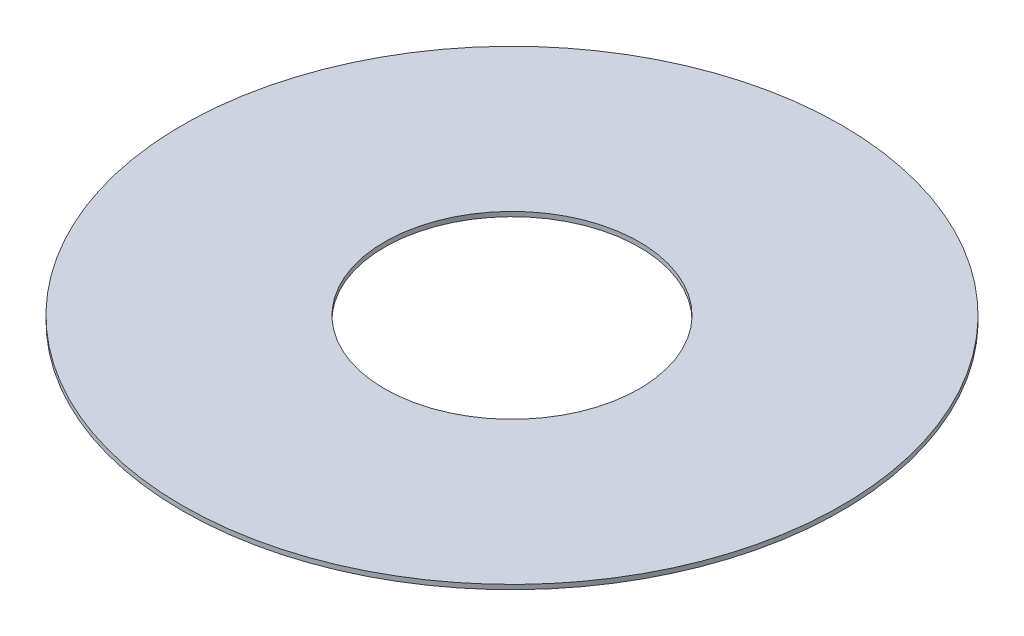
ISO-10303-21;
HEADER;
FILE_DESCRIPTION(('STEP AP214'),'2;1');
FILE_NAME('part.step','',(''),(''),'','','');
FILE_SCHEMA(('AUTOMOTIVE_DESIGN { 1 0 10303 214 1 1 1 1 }'));
ENDSEC;
DATA;
#1=APPLICATION_CONTEXT('core data for automotive mechanical design processes');
#2=APPLICATION_PROTOCOL_DEFINITION('international standard','automotive_design',2000,#1);
#3=PRODUCT_CONTEXT('',#1,'mechanical');
#4=PRODUCT('Part','Part','',(#3));
#5=PRODUCT_RELATED_PRODUCT_CATEGORY('part','',(#4));
#6=PRODUCT_DEFINITION_FORMATION('','',#4);
#7=PRODUCT_DEFINITION_CONTEXT('part definition',#1,'design');
#8=PRODUCT_DEFINITION('design','',#6,#7);
#9=PRODUCT_DEFINITION_SHAPE('','',#8);
#10=(LENGTH_UNIT() NAMED_UNIT(*) SI_UNIT(.MILLI.,.METRE.));
#11=(NAMED_UNIT(*) PLANE_ANGLE_UNIT() SI_UNIT($,.RADIAN.));
#12=(NAMED_UNIT(*) SI_UNIT($,.STERADIAN.) SOLID_ANGLE_UNIT());
#13=UNCERTAINTY_MEASURE_WITH_UNIT(LENGTH_MEASURE(1.E-05),#10,'distance_accuracy_value','');
#14=(GEOMETRIC_REPRESENTATION_CONTEXT(3) GLOBAL_UNCERTAINTY_ASSIGNED_CONTEXT((#13)) GLOBAL_UNIT_ASSIGNED_CONTEXT((#10,
#11,#12)) REPRESENTATION_CONTEXT('',''));
#15=CARTESIAN_POINT('',(0.,0.,0.));
#16=DIRECTION('',(0.,0.,1.));
#17=DIRECTION('',(1.,0.,0.));
#18=AXIS2_PLACEMENT_3D('',#15,#16,#17);
#19=CARTESIAN_POINT('',(0.,0.4572,0.));
#20=DIRECTION('',(0.,1.,0.));
#21=DIRECTION('',(0.,0.,1.));
#22=AXIS2_PLACEMENT_3D('',#19,#20,#21);
#23=PLANE('',#22);
#24=CARTESIAN_POINT('',(0.,0.4572,0.));
#25=DIRECTION('',(0.,1.,0.));
#26=DIRECTION('',(0.,0.,1.));
#27=AXIS2_PLACEMENT_3D('',#24,#25,#26);
#28=CIRCLE('',#27,32.8676);
#29=CARTESIAN_POINT('',(0.,0.4572,32.8676));
#30=VERTEX_POINT('',#29);
#31=EDGE_CURVE('E10',#30,#30,#28,.T.);
#32=ORIENTED_EDGE('',*,*,#31,.T.);
#33=EDGE_LOOP('',(#32));
#34=FACE_BOUND('',#33,.T.);
#35=CARTESIAN_POINT('',(0.,0.4572,0.));
#36=DIRECTION('',(0.,1.,0.));
#37=DIRECTION('',(0.,0.,1.));
#38=AXIS2_PLACEMENT_3D('',#35,#36,#37);
#39=CIRCLE('',#38,12.7);
#40=CARTESIAN_POINT('',(0.,0.4572,12.7));
#41=VERTEX_POINT('',#40);
#42=EDGE_CURVE('E45',#41,#41,#39,.T.);
#43=ORIENTED_EDGE('',*,*,#42,.F.);
#44=EDGE_LOOP('',(#43));
#45=FACE_BOUND('',#44,.T.);
#46=ADVANCED_FACE('F34',(#34,#45),#23,.T.);
#47=CARTESIAN_POINT('',(0.,0.,0.));
#48=DIRECTION('',(0.,1.,0.));
#49=DIRECTION('',(0.,0.,1.));
#50=AXIS2_PLACEMENT_3D('',#47,#48,#49);
#51=PLANE('',#50);
#52=CARTESIAN_POINT('',(0.,0.,0.));
#53=DIRECTION('',(0.,1.,0.));
#54=DIRECTION('',(0.,0.,1.));
#55=AXIS2_PLACEMENT_3D('',#52,#53,#54);
#56=CIRCLE('',#55,32.8676);
#57=CARTESIAN_POINT('',(0.,0.,32.8676));
#58=VERTEX_POINT('',#57);
#59=EDGE_CURVE('E38',#58,#58,#56,.T.);
#60=ORIENTED_EDGE('',*,*,#59,.F.);
#61=EDGE_LOOP('',(#60));
#62=FACE_BOUND('',#61,.T.);
#63=CARTESIAN_POINT('',(0.,0.,0.));
#64=DIRECTION('',(0.,1.,0.));
#65=DIRECTION('',(0.,0.,1.));
#66=AXIS2_PLACEMENT_3D('',#63,#64,#65);
#67=CIRCLE('',#66,12.7);
#68=CARTESIAN_POINT('',(0.,0.,12.7));
#69=VERTEX_POINT('',#68);
#70=EDGE_CURVE('E47',#69,#69,#67,.T.);
#71=ORIENTED_EDGE('',*,*,#70,.T.);
#72=EDGE_LOOP('',(#71));
#73=FACE_BOUND('',#72,.T.);
#74=ADVANCED_FACE('F57',(#62,#73),#51,.F.);
#75=CARTESIAN_POINT('',(0.,0.4572,0.));
#76=DIRECTION('',(0.,-1.,0.));
#77=DIRECTION('',(0.,0.,-1.));
#78=AXIS2_PLACEMENT_3D('',#75,#76,#77);
#79=CYLINDRICAL_SURFACE('',#78,32.8676);
#80=ORIENTED_EDGE('',*,*,#31,.F.);
#81=EDGE_LOOP('',(#80));
#82=FACE_BOUND('',#81,.T.);
#83=ORIENTED_EDGE('',*,*,#59,.T.);
#84=EDGE_LOOP('',(#83));
#85=FACE_BOUND('',#84,.T.);
#86=ADVANCED_FACE('F36',(#82,#85),#79,.T.);
#87=CARTESIAN_POINT('',(0.,0.4572,0.));
#88=DIRECTION('',(0.,-1.,0.));
#89=DIRECTION('',(0.,0.,-1.));
#90=AXIS2_PLACEMENT_3D('',#87,#88,#89);
#91=CYLINDRICAL_SURFACE('',#90,12.7);
#92=ORIENTED_EDGE('',*,*,#42,.T.);
#93=EDGE_LOOP('',(#92));
#94=FACE_BOUND('',#93,.T.);
#95=ORIENTED_EDGE('',*,*,#70,.F.);
#96=EDGE_LOOP('',(#95));
#97=FACE_BOUND('',#96,.T.);
#98=ADVANCED_FACE('F53',(#94,#97),#91,.F.);
#99=CLOSED_SHELL('',(#46,#74,#86,#98));
#100=MANIFOLD_SOLID_BREP('B2',#99);
#101=ADVANCED_BREP_SHAPE_REPRESENTATION('',(#18,#100),#14);
#102=SHAPE_DEFINITION_REPRESENTATION(#9,#101);
ENDSEC;
END-ISO-10303-21;
